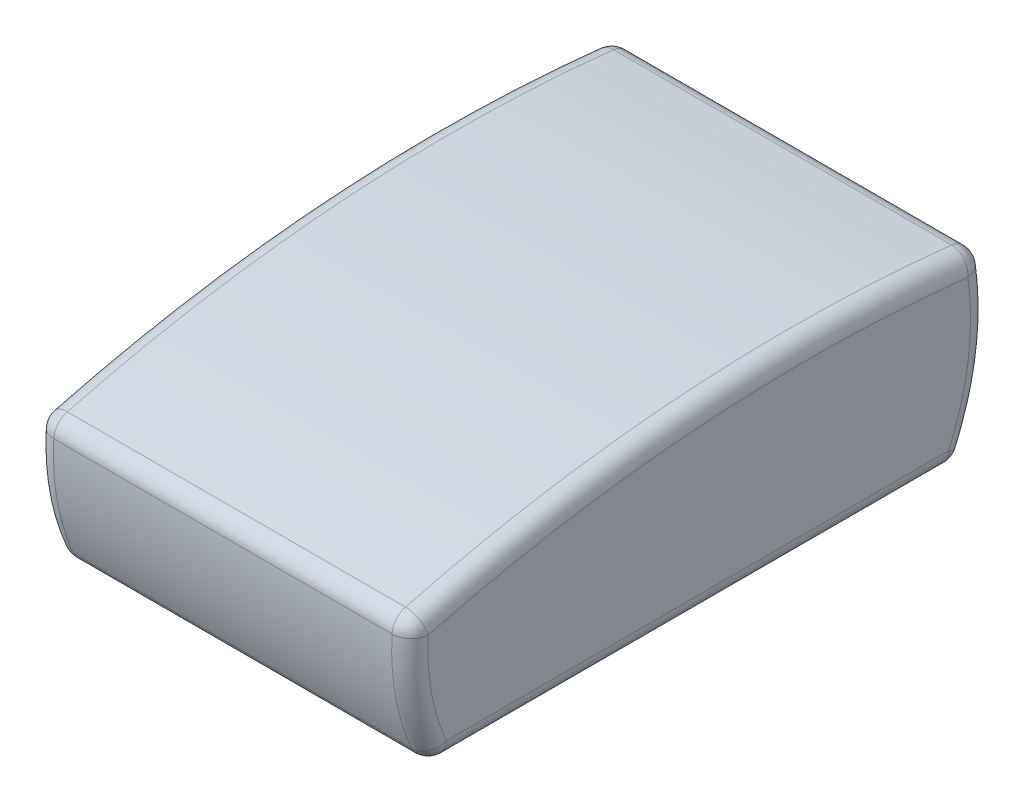
ISO-10303-21;
HEADER;
FILE_DESCRIPTION(('STEP AP214'),'2;1');
FILE_NAME('part.step','',(''),(''),'','','');
FILE_SCHEMA(('AUTOMOTIVE_DESIGN { 1 0 10303 214 1 1 1 1 }'));
ENDSEC;
DATA;
#1=APPLICATION_CONTEXT('core data for automotive mechanical design processes');
#2=APPLICATION_PROTOCOL_DEFINITION('international standard','automotive_design',2000,#1);
#3=PRODUCT_CONTEXT('',#1,'mechanical');
#4=PRODUCT('Part','Part','',(#3));
#5=PRODUCT_RELATED_PRODUCT_CATEGORY('part','',(#4));
#6=PRODUCT_DEFINITION_FORMATION('','',#4);
#7=PRODUCT_DEFINITION_CONTEXT('part definition',#1,'design');
#8=PRODUCT_DEFINITION('design','',#6,#7);
#9=PRODUCT_DEFINITION_SHAPE('','',#8);
#10=(LENGTH_UNIT() NAMED_UNIT(*) SI_UNIT(.MILLI.,.METRE.));
#11=(NAMED_UNIT(*) PLANE_ANGLE_UNIT() SI_UNIT($,.RADIAN.));
#12=(NAMED_UNIT(*) SI_UNIT($,.STERADIAN.) SOLID_ANGLE_UNIT());
#13=UNCERTAINTY_MEASURE_WITH_UNIT(LENGTH_MEASURE(1.E-05),#10,'distance_accuracy_value','');
#14=(GEOMETRIC_REPRESENTATION_CONTEXT(3) GLOBAL_UNCERTAINTY_ASSIGNED_CONTEXT((#13)) GLOBAL_UNIT_ASSIGNED_CONTEXT((#10,
#11,#12)) REPRESENTATION_CONTEXT('',''));
#15=CARTESIAN_POINT('',(0.,0.,0.));
#16=DIRECTION('',(0.,0.,1.));
#17=DIRECTION('',(1.,0.,0.));
#18=AXIS2_PLACEMENT_3D('',#15,#16,#17);
#19=CARTESIAN_POINT('',(62.,17.669622753354,7.61428652298865));
#20=DIRECTION('',(-1.,0.,0.));
#21=DIRECTION('',(0.,0.,1.));
#22=AXIS2_PLACEMENT_3D('',#19,#20,#21);
#23=CYLINDRICAL_SURFACE('',#22,40.);
#24=CARTESIAN_POINT('',(3.,17.669622753354,7.61428652298865));
#25=DIRECTION('',(-1.,0.,0.));
#26=DIRECTION('',(0.,0.,1.));
#27=AXIS2_PLACEMENT_3D('',#24,#25,#26);
#28=CIRCLE('',#27,40.);
#29=CARTESIAN_POINT('',(3.,19.8070187312472,47.5571399317486));
#30=VERTEX_POINT('',#29);
#31=CARTESIAN_POINT('',(3.,1.81057112810643,44.3360849749672));
#32=VERTEX_POINT('',#31);
#33=EDGE_CURVE('E269',#30,#32,#28,.F.);
#34=ORIENTED_EDGE('',*,*,#33,.T.);
#35=DIRECTION('',(-1.,0.,0.));
#36=VECTOR('',#35,1.);
#37=CARTESIAN_POINT('',(62.,1.81057112810643,44.3360849749672));
#38=LINE('',#37,#36);
#39=CARTESIAN_POINT('',(59.,1.81057112810643,44.3360849749672));
#40=VERTEX_POINT('',#39);
#41=EDGE_CURVE('E273',#32,#40,#38,.F.);
#42=ORIENTED_EDGE('',*,*,#41,.T.);
#43=CARTESIAN_POINT('',(59.,17.669622753354,7.61428652298865));
#44=DIRECTION('',(-1.,0.,0.));
#45=DIRECTION('',(0.,0.,1.));
#46=AXIS2_PLACEMENT_3D('',#43,#44,#45);
#47=CIRCLE('',#46,40.);
#48=CARTESIAN_POINT('',(59.,19.8070187312472,47.5571399317486));
#49=VERTEX_POINT('',#48);
#50=EDGE_CURVE('E271',#40,#49,#47,.T.);
#51=ORIENTED_EDGE('',*,*,#50,.T.);
#52=DIRECTION('',(-1.,0.,0.));
#53=VECTOR('',#52,1.);
#54=CARTESIAN_POINT('',(62.,19.8070187312472,47.5571399317486));
#55=LINE('',#54,#53);
#56=EDGE_CURVE('E267',#49,#30,#55,.T.);
#57=ORIENTED_EDGE('',*,*,#56,.T.);
#58=EDGE_LOOP('',(#34,#42,#51,#57));
#59=FACE_BOUND('',#58,.T.);
#60=ADVANCED_FACE('F33',(#59),#23,.T.);
#61=CARTESIAN_POINT('',(62.,0.,43.5));
#62=DIRECTION('',(0.,1.,0.));
#63=DIRECTION('',(0.,0.,1.));
#64=AXIS2_PLACEMENT_3D('',#61,#62,#63);
#65=PLANE('',#64);
#66=DIRECTION('',(0.,0.,-1.));
#67=VECTOR('',#66,1.);
#68=CARTESIAN_POINT('',(55.,0.,0.));
#69=LINE('',#68,#67);
#70=CARTESIAN_POINT('',(55.,0.,5.61428652298865));
#71=VERTEX_POINT('',#70);
#72=CARTESIAN_POINT('',(55.,0.,-2.44286006825142));
#73=VERTEX_POINT('',#72);
#74=EDGE_CURVE('E200',#71,#73,#69,.T.);
#75=ORIENTED_EDGE('',*,*,#74,.T.);
#76=CARTESIAN_POINT('',(51.,0.,-2.44286006825142));
#77=DIRECTION('',(0.,-1.,0.));
#78=DIRECTION('',(0.,0.,-1.));
#79=AXIS2_PLACEMENT_3D('',#76,#77,#78);
#80=CIRCLE('',#79,4.00000000000001);
#81=CARTESIAN_POINT('',(47.,0.,-2.44286006825142));
#82=VERTEX_POINT('',#81);
#83=EDGE_CURVE('E50',#82,#73,#80,.T.);
#84=ORIENTED_EDGE('',*,*,#83,.F.);
#85=DIRECTION('',(0.,0.,1.));
#86=VECTOR('',#85,1.);
#87=CARTESIAN_POINT('',(47.,0.,0.));
#88=LINE('',#87,#86);
#89=CARTESIAN_POINT('',(47.,0.,5.61428652298865));
#90=VERTEX_POINT('',#89);
#91=EDGE_CURVE('E191',#82,#90,#88,.T.);
#92=ORIENTED_EDGE('',*,*,#91,.T.);
#93=CARTESIAN_POINT('',(51.,0.,5.61428652298865));
#94=DIRECTION('',(0.,-1.,0.));
#95=DIRECTION('',(0.,0.,-1.));
#96=AXIS2_PLACEMENT_3D('',#93,#94,#95);
#97=CIRCLE('',#96,4.00000000000001);
#98=EDGE_CURVE('E194',#71,#90,#97,.T.);
#99=ORIENTED_EDGE('',*,*,#98,.F.);
#100=EDGE_LOOP('',(#75,#84,#92,#99));
#101=FACE_BOUND('',#100,.T.);
#102=CARTESIAN_POINT('',(11.,0.,5.61428652298865));
#103=DIRECTION('',(0.,-1.,0.));
#104=DIRECTION('',(0.,0.,-1.));
#105=AXIS2_PLACEMENT_3D('',#102,#103,#104);
#106=CIRCLE('',#105,4.);
#107=CARTESIAN_POINT('',(15.,0.,5.61428652298865));
#108=VERTEX_POINT('',#107);
#109=CARTESIAN_POINT('',(7.00000000000001,0.,5.61428652298865));
#110=VERTEX_POINT('',#109);
#111=EDGE_CURVE('E224',#108,#110,#106,.T.);
#112=ORIENTED_EDGE('',*,*,#111,.F.);
#113=DIRECTION('',(0.,0.,1.));
#114=VECTOR('',#113,1.);
#115=CARTESIAN_POINT('',(15.,0.,0.));
#116=LINE('',#115,#114);
#117=CARTESIAN_POINT('',(15.,0.,-2.44286006825142));
#118=VERTEX_POINT('',#117);
#119=EDGE_CURVE('E58',#118,#108,#116,.T.);
#120=ORIENTED_EDGE('',*,*,#119,.F.);
#121=CARTESIAN_POINT('',(11.,0.,-2.44286006825142));
#122=DIRECTION('',(0.,-1.,0.));
#123=DIRECTION('',(0.,0.,-1.));
#124=AXIS2_PLACEMENT_3D('',#121,#122,#123);
#125=CIRCLE('',#124,4.);
#126=CARTESIAN_POINT('',(7.00000000000001,0.,-2.44286006825142));
#127=VERTEX_POINT('',#126);
#128=EDGE_CURVE('E213',#127,#118,#125,.T.);
#129=ORIENTED_EDGE('',*,*,#128,.F.);
#130=DIRECTION('',(0.,0.,-1.));
#131=VECTOR('',#130,1.);
#132=CARTESIAN_POINT('',(7.00000000000001,0.,0.));
#133=LINE('',#132,#131);
#134=EDGE_CURVE('E227',#110,#127,#133,.T.);
#135=ORIENTED_EDGE('',*,*,#134,.F.);
#136=EDGE_LOOP('',(#112,#120,#129,#135));
#137=FACE_BOUND('',#136,.T.);
#138=DIRECTION('',(0.,0.,-1.));
#139=VECTOR('',#138,1.);
#140=CARTESIAN_POINT('',(3.,0.,-43.5));
#141=LINE('',#140,#139);
#142=CARTESIAN_POINT('',(3.,0.,41.5819500910688));
#143=VERTEX_POINT('',#142);
#144=CARTESIAN_POINT('',(3.,0.,-41.6007778792662));
#145=VERTEX_POINT('',#144);
#146=EDGE_CURVE('E253',#143,#145,#141,.T.);
#147=ORIENTED_EDGE('',*,*,#146,.T.);
#148=DIRECTION('',(-1.,0.,0.));
#149=VECTOR('',#148,1.);
#150=CARTESIAN_POINT('',(62.,0.,-41.6007778792662));
#151=LINE('',#150,#149);
#152=CARTESIAN_POINT('',(59.,0.,-41.6007778792662));
#153=VERTEX_POINT('',#152);
#154=EDGE_CURVE('E255',#145,#153,#151,.F.);
#155=ORIENTED_EDGE('',*,*,#154,.T.);
#156=DIRECTION('',(0.,0.,-1.));
#157=VECTOR('',#156,1.);
#158=CARTESIAN_POINT('',(59.,0.,43.5));
#159=LINE('',#158,#157);
#160=CARTESIAN_POINT('',(59.,0.,41.5819500910688));
#161=VERTEX_POINT('',#160);
#162=EDGE_CURVE('E249',#153,#161,#159,.F.);
#163=ORIENTED_EDGE('',*,*,#162,.T.);
#164=DIRECTION('',(-1.,0.,0.));
#165=VECTOR('',#164,1.);
#166=CARTESIAN_POINT('',(62.,0.,41.5819500910688));
#167=LINE('',#166,#165);
#168=EDGE_CURVE('E251',#161,#143,#167,.T.);
#169=ORIENTED_EDGE('',*,*,#168,.T.);
#170=EDGE_LOOP('',(#147,#155,#163,#169));
#171=FACE_BOUND('',#170,.T.);
#172=ADVANCED_FACE('F433',(#101,#137,#171),#65,.F.);
#173=CARTESIAN_POINT('',(62.,20.1185018573751,-3.2477220145891));
#174=DIRECTION('',(-1.,0.,0.));
#175=DIRECTION('',(0.,0.,1.));
#176=AXIS2_PLACEMENT_3D('',#173,#174,#175);
#177=CYLINDRICAL_SURFACE('',#176,45.);
#178=DIRECTION('',(-1.,0.,0.));
#179=VECTOR('',#178,1.);
#180=CARTESIAN_POINT('',(62.,1.77724986733036,-44.3402818696003));
#181=LINE('',#180,#179);
#182=CARTESIAN_POINT('',(59.,1.77724986733036,-44.3402818696003));
#183=VERTEX_POINT('',#182);
#184=CARTESIAN_POINT('',(3.,1.77724986733036,-44.3402818696003));
#185=VERTEX_POINT('',#184);
#186=EDGE_CURVE('E244',#183,#185,#181,.T.);
#187=ORIENTED_EDGE('',*,*,#186,.T.);
#188=CARTESIAN_POINT('',(3.,20.1185018573751,-3.2477220145891));
#189=DIRECTION('',(-1.,0.,0.));
#190=DIRECTION('',(0.,0.,1.));
#191=AXIS2_PLACEMENT_3D('',#188,#189,#190);
#192=CIRCLE('',#191,45.);
#193=CARTESIAN_POINT('',(3.,26.7115039153583,-47.7621278161207));
#194=VERTEX_POINT('',#193);
#195=EDGE_CURVE('E247',#185,#194,#192,.F.);
#196=ORIENTED_EDGE('',*,*,#195,.T.);
#197=DIRECTION('',(-1.,0.,0.));
#198=VECTOR('',#197,1.);
#199=CARTESIAN_POINT('',(62.,26.7115039153583,-47.7621278161207));
#200=LINE('',#199,#198);
#201=CARTESIAN_POINT('',(59.,26.7115039153583,-47.7621278161207));
#202=VERTEX_POINT('',#201);
#203=EDGE_CURVE('E242',#194,#202,#200,.F.);
#204=ORIENTED_EDGE('',*,*,#203,.T.);
#205=CARTESIAN_POINT('',(59.,20.1185018573751,-3.2477220145891));
#206=DIRECTION('',(-1.,0.,0.));
#207=DIRECTION('',(0.,0.,1.));
#208=AXIS2_PLACEMENT_3D('',#205,#206,#207);
#209=CIRCLE('',#208,45.);
#210=EDGE_CURVE('E240',#202,#183,#209,.T.);
#211=ORIENTED_EDGE('',*,*,#210,.T.);
#212=EDGE_LOOP('',(#187,#196,#204,#211));
#213=FACE_BOUND('',#212,.T.);
#214=ADVANCED_FACE('F439',(#213),#177,.T.);
#215=CARTESIAN_POINT('',(62.,-219.27880794698,-18.077179954302));
#216=DIRECTION('',(-1.,0.,0.));
#217=DIRECTION('',(0.,0.,1.));
#218=AXIS2_PLACEMENT_3D('',#215,#216,#217);
#219=CYLINDRICAL_SURFACE('',#218,250.);
#220=CARTESIAN_POINT('',(59.,-219.27880794698,-18.077179954302));
#221=DIRECTION('',(-1.,0.,0.));
#222=DIRECTION('',(0.,0.,1.));
#223=AXIS2_PLACEMENT_3D('',#220,#221,#222);
#224=CIRCLE('',#223,250.);
#225=CARTESIAN_POINT('',(59.,22.548643449665,45.322218710064));
#226=VERTEX_POINT('',#225);
#227=CARTESIAN_POINT('',(59.,29.2543685629452,-45.1190026348518));
#228=VERTEX_POINT('',#227);
#229=EDGE_CURVE('E287',#226,#228,#224,.T.);
#230=ORIENTED_EDGE('',*,*,#229,.T.);
#231=DIRECTION('',(-1.,0.,0.));
#232=VECTOR('',#231,1.);
#233=CARTESIAN_POINT('',(62.,29.2543685629452,-45.1190026348518));
#234=LINE('',#233,#232);
#235=CARTESIAN_POINT('',(3.,29.2543685629452,-45.1190026348518));
#236=VERTEX_POINT('',#235);
#237=EDGE_CURVE('E11',#228,#236,#234,.T.);
#238=ORIENTED_EDGE('',*,*,#237,.T.);
#239=CARTESIAN_POINT('',(3.,-219.27880794698,-18.077179954302));
#240=DIRECTION('',(-1.,0.,0.));
#241=DIRECTION('',(0.,0.,1.));
#242=AXIS2_PLACEMENT_3D('',#239,#240,#241);
#243=CIRCLE('',#242,250.);
#244=CARTESIAN_POINT('',(3.,22.548643449665,45.322218710064));
#245=VERTEX_POINT('',#244);
#246=EDGE_CURVE('E42',#236,#245,#243,.F.);
#247=ORIENTED_EDGE('',*,*,#246,.T.);
#248=DIRECTION('',(-1.,0.,0.));
#249=VECTOR('',#248,1.);
#250=CARTESIAN_POINT('',(62.,22.548643449665,45.322218710064));
#251=LINE('',#250,#249);
#252=EDGE_CURVE('E285',#245,#226,#251,.F.);
#253=ORIENTED_EDGE('',*,*,#252,.T.);
#254=EDGE_LOOP('',(#230,#238,#247,#253));
#255=FACE_BOUND('',#254,.T.);
#256=ADVANCED_FACE('F380',(#255),#219,.T.);
#257=CARTESIAN_POINT('',(62.,17.669622753354,7.61428652298865));
#258=DIRECTION('',(-1.,0.,0.));
#259=DIRECTION('',(0.,0.,1.));
#260=AXIS2_PLACEMENT_3D('',#257,#258,#259);
#261=PLANE('',#260);
#262=CARTESIAN_POINT('',(62.,17.669622753354,7.61428652298865));
#263=DIRECTION('',(-1.,0.,0.));
#264=DIRECTION('',(0.,0.,1.));
#265=AXIS2_PLACEMENT_3D('',#262,#263,#264);
#266=CIRCLE('',#265,37.);
#267=CARTESIAN_POINT('',(62.,19.6467140329052,44.5614259260916));
#268=VERTEX_POINT('',#267);
#269=CARTESIAN_POINT('',(62.,3.,41.5819500910688));
#270=VERTEX_POINT('',#269);
#271=EDGE_CURVE('E278',#268,#270,#266,.F.);
#272=ORIENTED_EDGE('',*,*,#271,.T.);
#273=DIRECTION('',(0.,0.,-1.));
#274=VECTOR('',#273,1.);
#275=CARTESIAN_POINT('',(62.,3.00000000000001,7.61428652298865));
#276=LINE('',#275,#274);
#277=CARTESIAN_POINT('',(62.,3.00000000000003,-41.6007778792662));
#278=VERTEX_POINT('',#277);
#279=EDGE_CURVE('E282',#270,#278,#276,.T.);
#280=ORIENTED_EDGE('',*,*,#279,.T.);
#281=CARTESIAN_POINT('',(62.,20.1185018573751,-3.2477220145891));
#282=DIRECTION('',(-1.,0.,0.));
#283=DIRECTION('',(0.,0.,1.));
#284=AXIS2_PLACEMENT_3D('',#281,#282,#283);
#285=CIRCLE('',#284,42.);
#286=CARTESIAN_POINT('',(62.,26.271970444826,-44.7945007626852));
#287=VERTEX_POINT('',#286);
#288=EDGE_CURVE('E280',#278,#287,#285,.F.);
#289=ORIENTED_EDGE('',*,*,#288,.T.);
#290=CARTESIAN_POINT('',(62.,-219.27880794698,-18.077179954302));
#291=DIRECTION('',(-1.,0.,0.));
#292=DIRECTION('',(0.,0.,1.));
#293=AXIS2_PLACEMENT_3D('',#290,#291,#292);
#294=CIRCLE('',#293,247.);
#295=EDGE_CURVE('E276',#287,#268,#294,.F.);
#296=ORIENTED_EDGE('',*,*,#295,.T.);
#297=EDGE_LOOP('',(#272,#280,#289,#296));
#298=FACE_BOUND('',#297,.T.);
#299=ADVANCED_FACE('F371',(#298),#261,.F.);
#300=CARTESIAN_POINT('',(0.,17.669622753354,7.61428652298865));
#301=DIRECTION('',(-1.,0.,0.));
#302=DIRECTION('',(0.,0.,1.));
#303=AXIS2_PLACEMENT_3D('',#300,#301,#302);
#304=PLANE('',#303);
#305=CARTESIAN_POINT('',(0.,20.1185018573751,-3.2477220145891));
#306=DIRECTION('',(-1.,0.,0.));
#307=DIRECTION('',(0.,0.,1.));
#308=AXIS2_PLACEMENT_3D('',#305,#306,#307);
#309=CIRCLE('',#308,42.);
#310=CARTESIAN_POINT('',(0.,26.271970444826,-44.7945007626852));
#311=VERTEX_POINT('',#310);
#312=CARTESIAN_POINT('',(0.,3.00000000000003,-41.6007778792662));
#313=VERTEX_POINT('',#312);
#314=EDGE_CURVE('E262',#311,#313,#309,.T.);
#315=ORIENTED_EDGE('',*,*,#314,.T.);
#316=DIRECTION('',(0.,0.,-1.));
#317=VECTOR('',#316,1.);
#318=CARTESIAN_POINT('',(0.,3.,43.5));
#319=LINE('',#318,#317);
#320=CARTESIAN_POINT('',(0.,3.,41.5819500910688));
#321=VERTEX_POINT('',#320);
#322=EDGE_CURVE('E264',#313,#321,#319,.F.);
#323=ORIENTED_EDGE('',*,*,#322,.T.);
#324=CARTESIAN_POINT('',(0.,17.669622753354,7.61428652298865));
#325=DIRECTION('',(-1.,0.,0.));
#326=DIRECTION('',(0.,0.,1.));
#327=AXIS2_PLACEMENT_3D('',#324,#325,#326);
#328=CIRCLE('',#327,37.);
#329=CARTESIAN_POINT('',(0.,19.6467140329052,44.5614259260916));
#330=VERTEX_POINT('',#329);
#331=EDGE_CURVE('E260',#321,#330,#328,.T.);
#332=ORIENTED_EDGE('',*,*,#331,.T.);
#333=CARTESIAN_POINT('',(0.,-219.27880794698,-18.077179954302));
#334=DIRECTION('',(-1.,0.,0.));
#335=DIRECTION('',(0.,0.,1.));
#336=AXIS2_PLACEMENT_3D('',#333,#334,#335);
#337=CIRCLE('',#336,247.);
#338=EDGE_CURVE('E258',#330,#311,#337,.T.);
#339=ORIENTED_EDGE('',*,*,#338,.T.);
#340=EDGE_LOOP('',(#315,#323,#332,#339));
#341=FACE_BOUND('',#340,.T.);
#342=ADVANCED_FACE('F489',(#341),#304,.T.);
#343=CARTESIAN_POINT('',(62.,19.6467140329052,44.5614259260916));
#344=DIRECTION('',(-1.,0.,0.));
#345=DIRECTION('',(0.,0.,1.));
#346=AXIS2_PLACEMENT_3D('',#343,#344,#345);
#347=CYLINDRICAL_SURFACE('',#346,3.);
#348=CARTESIAN_POINT('',(59.,19.6467140329053,44.5614259260916));
#349=DIRECTION('',(1.,0.,0.));
#350=DIRECTION('',(0.,0.,-1.));
#351=AXIS2_PLACEMENT_3D('',#348,#349,#350);
#352=CIRCLE('',#351,3.);
#353=EDGE_CURVE('E37',#226,#49,#352,.T.);
#354=ORIENTED_EDGE('',*,*,#353,.F.);
#355=ORIENTED_EDGE('',*,*,#252,.F.);
#356=CARTESIAN_POINT('',(3.,19.6467140329052,44.5614259260916));
#357=DIRECTION('',(-1.,0.,0.));
#358=DIRECTION('',(0.,0.,1.));
#359=AXIS2_PLACEMENT_3D('',#356,#357,#358);
#360=CIRCLE('',#359,3.);
#361=EDGE_CURVE('E348',#30,#245,#360,.T.);
#362=ORIENTED_EDGE('',*,*,#361,.F.);
#363=ORIENTED_EDGE('',*,*,#56,.F.);
#364=EDGE_LOOP('',(#354,#355,#362,#363));
#365=FACE_BOUND('',#364,.T.);
#366=ADVANCED_FACE('F35',(#365),#347,.T.);
#367=CARTESIAN_POINT('',(59.,19.6467140329052,44.5614259260916));
#368=DIRECTION('',(0.,0.,1.));
#369=DIRECTION('',(1.,0.,0.));
#370=AXIS2_PLACEMENT_3D('',#367,#368,#369);
#371=SPHERICAL_SURFACE('',#370,3.);
#372=CARTESIAN_POINT('',(59.,19.6467140329052,44.5614259260916));
#373=DIRECTION('',(0.,-0.253597594657465,0.96730980558658));
#374=DIRECTION('',(0.,-0.967309805586581,-0.253597594657465));
#375=AXIS2_PLACEMENT_3D('',#372,#373,#374);
#376=CIRCLE('',#375,3.);
#377=EDGE_CURVE('E343',#226,#268,#376,.F.);
#378=ORIENTED_EDGE('',*,*,#377,.F.);
#379=ORIENTED_EDGE('',*,*,#353,.T.);
#380=CARTESIAN_POINT('',(59.,19.6467140329052,44.5614259260916));
#381=DIRECTION('',(0.,0.998571335218999,-0.0534348994473306));
#382=DIRECTION('',(0.,0.0534348994473306,0.998571335218999));
#383=AXIS2_PLACEMENT_3D('',#380,#381,#382);
#384=CIRCLE('',#383,3.);
#385=EDGE_CURVE('E346',#268,#49,#384,.F.);
#386=ORIENTED_EDGE('',*,*,#385,.F.);
#387=EDGE_LOOP('',(#378,#379,#386));
#388=FACE_BOUND('',#387,.T.);
#389=ADVANCED_FACE('F359',(#388),#371,.T.);
#390=CARTESIAN_POINT('',(3.,19.6467140329052,44.5614259260916));
#391=DIRECTION('',(0.,0.,1.));
#392=DIRECTION('',(1.,0.,0.));
#393=AXIS2_PLACEMENT_3D('',#390,#391,#392);
#394=SPHERICAL_SURFACE('',#393,3.);
#395=CARTESIAN_POINT('',(3.,19.6467140329052,44.5614259260916));
#396=DIRECTION('',(0.,0.998571335218999,-0.0534348994473329));
#397=DIRECTION('',(0.,0.0534348994473329,0.998571335218999));
#398=AXIS2_PLACEMENT_3D('',#395,#396,#397);
#399=CIRCLE('',#398,3.);
#400=EDGE_CURVE('E337',#30,#330,#399,.F.);
#401=ORIENTED_EDGE('',*,*,#400,.F.);
#402=ORIENTED_EDGE('',*,*,#361,.T.);
#403=CARTESIAN_POINT('',(3.,19.6467140329053,44.5614259260916));
#404=DIRECTION('',(0.,-0.253597594657463,0.967309805586581));
#405=DIRECTION('',(0.,-0.967309805586581,-0.253597594657463));
#406=AXIS2_PLACEMENT_3D('',#403,#404,#405);
#407=CIRCLE('',#406,3.);
#408=EDGE_CURVE('E340',#330,#245,#407,.F.);
#409=ORIENTED_EDGE('',*,*,#408,.F.);
#410=EDGE_LOOP('',(#401,#402,#409));
#411=FACE_BOUND('',#410,.T.);
#412=ADVANCED_FACE('F395',(#411),#394,.T.);
#413=CARTESIAN_POINT('',(59.,17.669622753354,7.61428652298865));
#414=DIRECTION('',(-1.,0.,0.));
#415=DIRECTION('',(0.,0.,1.));
#416=AXIS2_PLACEMENT_3D('',#413,#414,#415);
#417=TOROIDAL_SURFACE('',#416,37.,3.);
#418=ORIENTED_EDGE('',*,*,#385,.T.);
#419=ORIENTED_EDGE('',*,*,#50,.F.);
#420=CARTESIAN_POINT('',(59.,3.,41.5819500910688));
#421=DIRECTION('',(0.,-0.918044961299463,-0.39647629063119));
#422=DIRECTION('',(0.,0.39647629063119,-0.918044961299463));
#423=AXIS2_PLACEMENT_3D('',#420,#421,#422);
#424=CIRCLE('',#423,3.);
#425=EDGE_CURVE('E332',#270,#40,#424,.T.);
#426=ORIENTED_EDGE('',*,*,#425,.F.);
#427=ORIENTED_EDGE('',*,*,#271,.F.);
#428=EDGE_LOOP('',(#418,#419,#426,#427));
#429=FACE_BOUND('',#428,.T.);
#430=ADVANCED_FACE('F367',(#429),#417,.T.);
#431=CARTESIAN_POINT('',(59.,-219.27880794698,-18.077179954302));
#432=DIRECTION('',(-1.,0.,0.));
#433=DIRECTION('',(0.,0.,1.));
#434=AXIS2_PLACEMENT_3D('',#431,#432,#433);
#435=TOROIDAL_SURFACE('',#434,247.,3.);
#436=ORIENTED_EDGE('',*,*,#377,.T.);
#437=ORIENTED_EDGE('',*,*,#295,.F.);
#438=CARTESIAN_POINT('',(59.,26.2719704448261,-44.7945007626852));
#439=DIRECTION('',(0.,-0.108167290722198,-0.994132706039701));
#440=DIRECTION('',(0.,0.994132706039701,-0.108167290722198));
#441=AXIS2_PLACEMENT_3D('',#438,#439,#440);
#442=CIRCLE('',#441,3.);
#443=EDGE_CURVE('E329',#228,#287,#442,.T.);
#444=ORIENTED_EDGE('',*,*,#443,.F.);
#445=ORIENTED_EDGE('',*,*,#229,.F.);
#446=EDGE_LOOP('',(#436,#437,#444,#445));
#447=FACE_BOUND('',#446,.T.);
#448=ADVANCED_FACE('F377',(#447),#435,.T.);
#449=CARTESIAN_POINT('',(62.,26.271970444826,-44.7945007626851));
#450=DIRECTION('',(-1.,0.,0.));
#451=DIRECTION('',(0.,0.,1.));
#452=AXIS2_PLACEMENT_3D('',#449,#450,#451);
#453=CYLINDRICAL_SURFACE('',#452,3.);
#454=CARTESIAN_POINT('',(3.,26.2719704448261,-44.7945007626852));
#455=DIRECTION('',(-1.,0.,0.));
#456=DIRECTION('',(0.,0.,1.));
#457=AXIS2_PLACEMENT_3D('',#454,#455,#456);
#458=CIRCLE('',#457,3.);
#459=EDGE_CURVE('E323',#236,#194,#458,.T.);
#460=ORIENTED_EDGE('',*,*,#459,.F.);
#461=ORIENTED_EDGE('',*,*,#237,.F.);
#462=CARTESIAN_POINT('',(59.,26.2719704448261,-44.7945007626852));
#463=DIRECTION('',(1.,0.,0.));
#464=DIRECTION('',(0.,0.,-1.));
#465=AXIS2_PLACEMENT_3D('',#462,#463,#464);
#466=CIRCLE('',#465,3.);
#467=EDGE_CURVE('E326',#202,#228,#466,.T.);
#468=ORIENTED_EDGE('',*,*,#467,.F.);
#469=ORIENTED_EDGE('',*,*,#203,.F.);
#470=EDGE_LOOP('',(#460,#461,#468,#469));
#471=FACE_BOUND('',#470,.T.);
#472=ADVANCED_FACE('F384',(#471),#453,.T.);
#473=CARTESIAN_POINT('',(3.,-219.27880794698,-18.077179954302));
#474=DIRECTION('',(-1.,0.,0.));
#475=DIRECTION('',(0.,0.,1.));
#476=AXIS2_PLACEMENT_3D('',#473,#474,#475);
#477=TOROIDAL_SURFACE('',#476,247.,3.);
#478=ORIENTED_EDGE('',*,*,#408,.T.);
#479=ORIENTED_EDGE('',*,*,#246,.F.);
#480=CARTESIAN_POINT('',(3.,26.271970444826,-44.7945007626852));
#481=DIRECTION('',(0.,-0.10816729072217,-0.994132706039705));
#482=DIRECTION('',(0.,0.994132706039705,-0.10816729072217));
#483=AXIS2_PLACEMENT_3D('',#480,#481,#482);
#484=CIRCLE('',#483,3.);
#485=EDGE_CURVE('E321',#311,#236,#484,.T.);
#486=ORIENTED_EDGE('',*,*,#485,.F.);
#487=ORIENTED_EDGE('',*,*,#338,.F.);
#488=EDGE_LOOP('',(#478,#479,#486,#487));
#489=FACE_BOUND('',#488,.T.);
#490=ADVANCED_FACE('F392',(#489),#477,.T.);
#491=CARTESIAN_POINT('',(3.,17.669622753354,7.61428652298865));
#492=DIRECTION('',(-1.,0.,0.));
#493=DIRECTION('',(0.,0.,1.));
#494=AXIS2_PLACEMENT_3D('',#491,#492,#493);
#495=TOROIDAL_SURFACE('',#494,37.,3.);
#496=ORIENTED_EDGE('',*,*,#400,.T.);
#497=ORIENTED_EDGE('',*,*,#331,.F.);
#498=CARTESIAN_POINT('',(3.,3.,41.5819500910688));
#499=DIRECTION('',(0.,-0.918044961299463,-0.39647629063119));
#500=DIRECTION('',(0.,0.39647629063119,-0.918044961299463));
#501=AXIS2_PLACEMENT_3D('',#498,#499,#500);
#502=CIRCLE('',#501,3.);
#503=EDGE_CURVE('E318',#32,#321,#502,.T.);
#504=ORIENTED_EDGE('',*,*,#503,.F.);
#505=ORIENTED_EDGE('',*,*,#33,.F.);
#506=EDGE_LOOP('',(#496,#497,#504,#505));
#507=FACE_BOUND('',#506,.T.);
#508=ADVANCED_FACE('F399',(#507),#495,.T.);
#509=CARTESIAN_POINT('',(62.,3.,41.5819500910688));
#510=DIRECTION('',(-1.,0.,0.));
#511=DIRECTION('',(0.,0.,1.));
#512=AXIS2_PLACEMENT_3D('',#509,#510,#511);
#513=CYLINDRICAL_SURFACE('',#512,3.);
#514=CARTESIAN_POINT('',(59.,3.,41.5819500910688));
#515=DIRECTION('',(1.,0.,0.));
#516=DIRECTION('',(0.,0.,-1.));
#517=AXIS2_PLACEMENT_3D('',#514,#515,#516);
#518=CIRCLE('',#517,3.);
#519=EDGE_CURVE('E334',#40,#161,#518,.T.);
#520=ORIENTED_EDGE('',*,*,#519,.F.);
#521=ORIENTED_EDGE('',*,*,#41,.F.);
#522=CARTESIAN_POINT('',(3.,3.,41.5819500910688));
#523=DIRECTION('',(-1.,0.,0.));
#524=DIRECTION('',(0.,0.,1.));
#525=AXIS2_PLACEMENT_3D('',#522,#523,#524);
#526=CIRCLE('',#525,3.);
#527=EDGE_CURVE('E315',#143,#32,#526,.T.);
#528=ORIENTED_EDGE('',*,*,#527,.F.);
#529=ORIENTED_EDGE('',*,*,#168,.F.);
#530=EDGE_LOOP('',(#520,#521,#528,#529));
#531=FACE_BOUND('',#530,.T.);
#532=ADVANCED_FACE('F405',(#531),#513,.T.);
#533=CARTESIAN_POINT('',(59.,3.,41.5819500910688));
#534=DIRECTION('',(0.,0.,1.));
#535=DIRECTION('',(1.,0.,0.));
#536=AXIS2_PLACEMENT_3D('',#533,#534,#535);
#537=SPHERICAL_SURFACE('',#536,3.);
#538=ORIENTED_EDGE('',*,*,#425,.T.);
#539=ORIENTED_EDGE('',*,*,#519,.T.);
#540=CARTESIAN_POINT('',(59.,3.,41.5819500910688));
#541=DIRECTION('',(0.,0.,1.));
#542=DIRECTION('',(1.,0.,0.));
#543=AXIS2_PLACEMENT_3D('',#540,#541,#542);
#544=CIRCLE('',#543,3.);
#545=EDGE_CURVE('E312',#270,#161,#544,.F.);
#546=ORIENTED_EDGE('',*,*,#545,.F.);
#547=EDGE_LOOP('',(#538,#539,#546));
#548=FACE_BOUND('',#547,.T.);
#549=ADVANCED_FACE('F409',(#548),#537,.T.);
#550=CARTESIAN_POINT('',(59.,26.2719704448261,-44.7945007626852));
#551=DIRECTION('',(0.,0.,1.));
#552=DIRECTION('',(1.,0.,0.));
#553=AXIS2_PLACEMENT_3D('',#550,#551,#552);
#554=SPHERICAL_SURFACE('',#553,3.);
#555=ORIENTED_EDGE('',*,*,#467,.T.);
#556=ORIENTED_EDGE('',*,*,#443,.T.);
#557=CARTESIAN_POINT('',(59.,26.271970444826,-44.7945007626852));
#558=DIRECTION('',(0.,0.989209017811812,0.146511156844077));
#559=DIRECTION('',(0.,-0.146511156844077,0.989209017811812));
#560=AXIS2_PLACEMENT_3D('',#557,#558,#559);
#561=CIRCLE('',#560,3.);
#562=EDGE_CURVE('E309',#202,#287,#561,.F.);
#563=ORIENTED_EDGE('',*,*,#562,.F.);
#564=EDGE_LOOP('',(#555,#556,#563));
#565=FACE_BOUND('',#564,.T.);
#566=ADVANCED_FACE('F421',(#565),#554,.T.);
#567=CARTESIAN_POINT('',(3.,26.2719704448261,-44.7945007626852));
#568=DIRECTION('',(0.,0.,1.));
#569=DIRECTION('',(1.,0.,0.));
#570=AXIS2_PLACEMENT_3D('',#567,#568,#569);
#571=SPHERICAL_SURFACE('',#570,3.);
#572=ORIENTED_EDGE('',*,*,#485,.T.);
#573=ORIENTED_EDGE('',*,*,#459,.T.);
#574=CARTESIAN_POINT('',(3.,26.2719704448261,-44.7945007626852));
#575=DIRECTION('',(0.,0.989209017811813,0.146511156844071));
#576=DIRECTION('',(0.,-0.146511156844071,0.989209017811813));
#577=AXIS2_PLACEMENT_3D('',#574,#575,#576);
#578=CIRCLE('',#577,3.);
#579=EDGE_CURVE('E306',#311,#194,#578,.F.);
#580=ORIENTED_EDGE('',*,*,#579,.F.);
#581=EDGE_LOOP('',(#572,#573,#580));
#582=FACE_BOUND('',#581,.T.);
#583=ADVANCED_FACE('F423',(#582),#571,.T.);
#584=CARTESIAN_POINT('',(3.,3.,41.5819500910688));
#585=DIRECTION('',(0.,0.,1.));
#586=DIRECTION('',(1.,0.,0.));
#587=AXIS2_PLACEMENT_3D('',#584,#585,#586);
#588=SPHERICAL_SURFACE('',#587,3.);
#589=ORIENTED_EDGE('',*,*,#527,.T.);
#590=ORIENTED_EDGE('',*,*,#503,.T.);
#591=CARTESIAN_POINT('',(3.,3.,41.5819500910688));
#592=DIRECTION('',(0.,0.,1.));
#593=DIRECTION('',(1.,0.,0.));
#594=AXIS2_PLACEMENT_3D('',#591,#592,#593);
#595=CIRCLE('',#594,3.);
#596=EDGE_CURVE('E304',#143,#321,#595,.F.);
#597=ORIENTED_EDGE('',*,*,#596,.F.);
#598=EDGE_LOOP('',(#589,#590,#597));
#599=FACE_BOUND('',#598,.T.);
#600=ADVANCED_FACE('F429',(#599),#588,.T.);
#601=CARTESIAN_POINT('',(59.,3.00000000000001,7.61428652298865));
#602=DIRECTION('',(0.,0.,-1.));
#603=DIRECTION('',(0.,1.,0.));
#604=AXIS2_PLACEMENT_3D('',#601,#602,#603);
#605=CYLINDRICAL_SURFACE('',#604,3.);
#606=ORIENTED_EDGE('',*,*,#545,.T.);
#607=ORIENTED_EDGE('',*,*,#162,.F.);
#608=CARTESIAN_POINT('',(59.,3.00000000000002,-41.6007778792663));
#609=DIRECTION('',(0.,0.,-1.));
#610=DIRECTION('',(0.,1.,0.));
#611=AXIS2_PLACEMENT_3D('',#608,#609,#610);
#612=CIRCLE('',#611,3.);
#613=EDGE_CURVE('E301',#278,#153,#612,.T.);
#614=ORIENTED_EDGE('',*,*,#613,.F.);
#615=ORIENTED_EDGE('',*,*,#279,.F.);
#616=EDGE_LOOP('',(#606,#607,#614,#615));
#617=FACE_BOUND('',#616,.T.);
#618=ADVANCED_FACE('F412',(#617),#605,.T.);
#619=CARTESIAN_POINT('',(59.,20.1185018573751,-3.2477220145891));
#620=DIRECTION('',(-1.,0.,0.));
#621=DIRECTION('',(0.,0.,1.));
#622=AXIS2_PLACEMENT_3D('',#619,#620,#621);
#623=TOROIDAL_SURFACE('',#622,42.,3.);
#624=ORIENTED_EDGE('',*,*,#562,.T.);
#625=ORIENTED_EDGE('',*,*,#288,.F.);
#626=CARTESIAN_POINT('',(59.,3.00000000000001,-41.6007778792662));
#627=DIRECTION('',(0.,-0.913167996778027,0.407583377556549));
#628=DIRECTION('',(0.,-0.407583377556549,-0.913167996778028));
#629=AXIS2_PLACEMENT_3D('',#626,#627,#628);
#630=CIRCLE('',#629,3.);
#631=EDGE_CURVE('E299',#183,#278,#630,.T.);
#632=ORIENTED_EDGE('',*,*,#631,.F.);
#633=ORIENTED_EDGE('',*,*,#210,.F.);
#634=EDGE_LOOP('',(#624,#625,#632,#633));
#635=FACE_BOUND('',#634,.T.);
#636=ADVANCED_FACE('F418',(#635),#623,.T.);
#637=CARTESIAN_POINT('',(3.,20.1185018573751,-3.2477220145891));
#638=DIRECTION('',(-1.,0.,0.));
#639=DIRECTION('',(0.,0.,1.));
#640=AXIS2_PLACEMENT_3D('',#637,#638,#639);
#641=TOROIDAL_SURFACE('',#640,42.,3.);
#642=ORIENTED_EDGE('',*,*,#579,.T.);
#643=ORIENTED_EDGE('',*,*,#195,.F.);
#644=CARTESIAN_POINT('',(3.,3.00000000000003,-41.6007778792662));
#645=DIRECTION('',(0.,-0.913167996778024,0.407583377556556));
#646=DIRECTION('',(0.,-0.407583377556556,-0.913167996778024));
#647=AXIS2_PLACEMENT_3D('',#644,#645,#646);
#648=CIRCLE('',#647,3.);
#649=EDGE_CURVE('E296',#313,#185,#648,.T.);
#650=ORIENTED_EDGE('',*,*,#649,.F.);
#651=ORIENTED_EDGE('',*,*,#314,.F.);
#652=EDGE_LOOP('',(#642,#643,#650,#651));
#653=FACE_BOUND('',#652,.T.);
#654=ADVANCED_FACE('F459',(#653),#641,.T.);
#655=CARTESIAN_POINT('',(3.,3.,43.5));
#656=DIRECTION('',(0.,0.,1.));
#657=DIRECTION('',(0.,-1.,0.));
#658=AXIS2_PLACEMENT_3D('',#655,#656,#657);
#659=CYLINDRICAL_SURFACE('',#658,3.);
#660=ORIENTED_EDGE('',*,*,#596,.T.);
#661=ORIENTED_EDGE('',*,*,#322,.F.);
#662=CARTESIAN_POINT('',(3.,3.00000000000002,-41.6007778792662));
#663=DIRECTION('',(0.,0.,-1.));
#664=DIRECTION('',(-1.,0.,0.));
#665=AXIS2_PLACEMENT_3D('',#662,#663,#664);
#666=CIRCLE('',#665,3.);
#667=EDGE_CURVE('E293',#145,#313,#666,.T.);
#668=ORIENTED_EDGE('',*,*,#667,.F.);
#669=ORIENTED_EDGE('',*,*,#146,.F.);
#670=EDGE_LOOP('',(#660,#661,#668,#669));
#671=FACE_BOUND('',#670,.T.);
#672=ADVANCED_FACE('F456',(#671),#659,.T.);
#673=CARTESIAN_POINT('',(59.,3.00000000000002,-41.6007778792662));
#674=DIRECTION('',(0.,0.,1.));
#675=DIRECTION('',(1.,0.,0.));
#676=AXIS2_PLACEMENT_3D('',#673,#674,#675);
#677=SPHERICAL_SURFACE('',#676,3.);
#678=ORIENTED_EDGE('',*,*,#631,.T.);
#679=ORIENTED_EDGE('',*,*,#613,.T.);
#680=CARTESIAN_POINT('',(59.,3.00000000000002,-41.6007778792662));
#681=DIRECTION('',(1.,0.,0.));
#682=DIRECTION('',(0.,0.,-1.));
#683=AXIS2_PLACEMENT_3D('',#680,#681,#682);
#684=CIRCLE('',#683,3.);
#685=EDGE_CURVE('E291',#183,#153,#684,.F.);
#686=ORIENTED_EDGE('',*,*,#685,.F.);
#687=EDGE_LOOP('',(#678,#679,#686));
#688=FACE_BOUND('',#687,.T.);
#689=ADVANCED_FACE('F452',(#688),#677,.T.);
#690=CARTESIAN_POINT('',(3.,3.00000000000002,-41.6007778792662));
#691=DIRECTION('',(0.,0.,1.));
#692=DIRECTION('',(1.,0.,0.));
#693=AXIS2_PLACEMENT_3D('',#690,#691,#692);
#694=SPHERICAL_SURFACE('',#693,3.);
#695=ORIENTED_EDGE('',*,*,#667,.T.);
#696=ORIENTED_EDGE('',*,*,#649,.T.);
#697=CARTESIAN_POINT('',(3.,3.00000000000001,-41.6007778792662));
#698=DIRECTION('',(-1.,0.,0.));
#699=DIRECTION('',(0.,0.,1.));
#700=AXIS2_PLACEMENT_3D('',#697,#698,#699);
#701=CIRCLE('',#700,3.);
#702=EDGE_CURVE('E234',#145,#185,#701,.F.);
#703=ORIENTED_EDGE('',*,*,#702,.F.);
#704=EDGE_LOOP('',(#695,#696,#703));
#705=FACE_BOUND('',#704,.T.);
#706=ADVANCED_FACE('F448',(#705),#694,.T.);
#707=CARTESIAN_POINT('',(62.,3.00000000000001,-41.6007778792662));
#708=DIRECTION('',(-1.,0.,0.));
#709=DIRECTION('',(0.,0.,1.));
#710=AXIS2_PLACEMENT_3D('',#707,#708,#709);
#711=CYLINDRICAL_SURFACE('',#710,3.);
#712=ORIENTED_EDGE('',*,*,#685,.T.);
#713=ORIENTED_EDGE('',*,*,#154,.F.);
#714=ORIENTED_EDGE('',*,*,#702,.T.);
#715=ORIENTED_EDGE('',*,*,#186,.F.);
#716=EDGE_LOOP('',(#712,#713,#714,#715));
#717=FACE_BOUND('',#716,.T.);
#718=ADVANCED_FACE('F444',(#717),#711,.T.);
#719=CARTESIAN_POINT('',(15.,20.,0.));
#720=DIRECTION('',(1.,0.,0.));
#721=DIRECTION('',(0.,0.,-1.));
#722=AXIS2_PLACEMENT_3D('',#719,#720,#721);
#723=PLANE('',#722);
#724=ORIENTED_EDGE('',*,*,#119,.T.);
#725=DIRECTION('',(0.,-1.,0.));
#726=VECTOR('',#725,1.);
#727=CARTESIAN_POINT('',(15.,20.,5.61428652298865));
#728=LINE('',#727,#726);
#729=CARTESIAN_POINT('',(15.,20.,5.61428652298865));
#730=VERTEX_POINT('',#729);
#731=EDGE_CURVE('E222',#730,#108,#728,.T.);
#732=ORIENTED_EDGE('',*,*,#731,.F.);
#733=DIRECTION('',(0.,0.,1.));
#734=VECTOR('',#733,1.);
#735=CARTESIAN_POINT('',(15.,20.,0.));
#736=LINE('',#735,#734);
#737=CARTESIAN_POINT('',(15.,20.,-2.44286006825141));
#738=VERTEX_POINT('',#737);
#739=EDGE_CURVE('E209',#738,#730,#736,.T.);
#740=ORIENTED_EDGE('',*,*,#739,.F.);
#741=DIRECTION('',(0.,-1.,0.));
#742=VECTOR('',#741,1.);
#743=CARTESIAN_POINT('',(15.,20.,-2.44286006825141));
#744=LINE('',#743,#742);
#745=EDGE_CURVE('E232',#738,#118,#744,.T.);
#746=ORIENTED_EDGE('',*,*,#745,.T.);
#747=EDGE_LOOP('',(#724,#732,#740,#746));
#748=FACE_BOUND('',#747,.T.);
#749=ADVANCED_FACE('F447',(#748),#723,.F.);
#750=CARTESIAN_POINT('',(11.,20.,-2.44286006825141));
#751=DIRECTION('',(0.,-1.,0.));
#752=DIRECTION('',(0.,0.,-1.));
#753=AXIS2_PLACEMENT_3D('',#750,#751,#752);
#754=CYLINDRICAL_SURFACE('',#753,4.);
#755=ORIENTED_EDGE('',*,*,#128,.T.);
#756=ORIENTED_EDGE('',*,*,#745,.F.);
#757=CARTESIAN_POINT('',(11.,20.,-2.44286006825141));
#758=DIRECTION('',(0.,-1.,0.));
#759=DIRECTION('',(0.,0.,-1.));
#760=AXIS2_PLACEMENT_3D('',#757,#758,#759);
#761=CIRCLE('',#760,4.);
#762=CARTESIAN_POINT('',(7.00000000000001,20.,-2.44286006825141));
#763=VERTEX_POINT('',#762);
#764=EDGE_CURVE('E219',#763,#738,#761,.T.);
#765=ORIENTED_EDGE('',*,*,#764,.F.);
#766=DIRECTION('',(0.,-1.,0.));
#767=VECTOR('',#766,1.);
#768=CARTESIAN_POINT('',(7.00000000000001,20.,-2.44286006825141));
#769=LINE('',#768,#767);
#770=EDGE_CURVE('E235',#763,#127,#769,.T.);
#771=ORIENTED_EDGE('',*,*,#770,.T.);
#772=EDGE_LOOP('',(#755,#756,#765,#771));
#773=FACE_BOUND('',#772,.T.);
#774=ADVANCED_FACE('F497',(#773),#754,.F.);
#775=CARTESIAN_POINT('',(7.00000000000001,20.,0.));
#776=DIRECTION('',(-1.,0.,0.));
#777=DIRECTION('',(0.,0.,1.));
#778=AXIS2_PLACEMENT_3D('',#775,#776,#777);
#779=PLANE('',#778);
#780=ORIENTED_EDGE('',*,*,#134,.T.);
#781=ORIENTED_EDGE('',*,*,#770,.F.);
#782=DIRECTION('',(0.,0.,-1.));
#783=VECTOR('',#782,1.);
#784=CARTESIAN_POINT('',(7.00000000000001,20.,0.));
#785=LINE('',#784,#783);
#786=CARTESIAN_POINT('',(7.00000000000001,20.,5.61428652298865));
#787=VERTEX_POINT('',#786);
#788=EDGE_CURVE('E216',#787,#763,#785,.T.);
#789=ORIENTED_EDGE('',*,*,#788,.F.);
#790=DIRECTION('',(0.,-1.,0.));
#791=VECTOR('',#790,1.);
#792=CARTESIAN_POINT('',(7.00000000000001,20.,5.61428652298865));
#793=LINE('',#792,#791);
#794=EDGE_CURVE('E237',#787,#110,#793,.T.);
#795=ORIENTED_EDGE('',*,*,#794,.T.);
#796=EDGE_LOOP('',(#780,#781,#789,#795));
#797=FACE_BOUND('',#796,.T.);
#798=ADVANCED_FACE('F502',(#797),#779,.F.);
#799=CARTESIAN_POINT('',(11.,20.,5.61428652298865));
#800=DIRECTION('',(0.,-1.,0.));
#801=DIRECTION('',(0.,0.,-1.));
#802=AXIS2_PLACEMENT_3D('',#799,#800,#801);
#803=CYLINDRICAL_SURFACE('',#802,4.);
#804=ORIENTED_EDGE('',*,*,#111,.T.);
#805=ORIENTED_EDGE('',*,*,#794,.F.);
#806=CARTESIAN_POINT('',(11.,20.,5.61428652298865));
#807=DIRECTION('',(0.,-1.,0.));
#808=DIRECTION('',(0.,0.,-1.));
#809=AXIS2_PLACEMENT_3D('',#806,#807,#808);
#810=CIRCLE('',#809,4.);
#811=EDGE_CURVE('E212',#730,#787,#810,.T.);
#812=ORIENTED_EDGE('',*,*,#811,.F.);
#813=ORIENTED_EDGE('',*,*,#731,.T.);
#814=EDGE_LOOP('',(#804,#805,#812,#813));
#815=FACE_BOUND('',#814,.T.);
#816=ADVANCED_FACE('F498',(#815),#803,.F.);
#817=CARTESIAN_POINT('',(0.,20.,0.));
#818=DIRECTION('',(0.,-1.,0.));
#819=DIRECTION('',(0.,0.,-1.));
#820=AXIS2_PLACEMENT_3D('',#817,#818,#819);
#821=PLANE('',#820);
#822=ORIENTED_EDGE('',*,*,#739,.T.);
#823=ORIENTED_EDGE('',*,*,#811,.T.);
#824=ORIENTED_EDGE('',*,*,#788,.T.);
#825=ORIENTED_EDGE('',*,*,#764,.T.);
#826=EDGE_LOOP('',(#822,#823,#824,#825));
#827=FACE_BOUND('',#826,.T.);
#828=ADVANCED_FACE('F501',(#827),#821,.T.);
#829=CARTESIAN_POINT('',(51.,20.,-2.44286006825141));
#830=DIRECTION('',(0.,-1.,0.));
#831=DIRECTION('',(0.,0.,-1.));
#832=AXIS2_PLACEMENT_3D('',#829,#830,#831);
#833=CYLINDRICAL_SURFACE('',#832,4.00000000000001);
#834=ORIENTED_EDGE('',*,*,#83,.T.);
#835=DIRECTION('',(0.,-1.,0.));
#836=VECTOR('',#835,1.);
#837=CARTESIAN_POINT('',(55.,20.,-2.44286006825141));
#838=LINE('',#837,#836);
#839=CARTESIAN_POINT('',(55.,20.,-2.44286006825141));
#840=VERTEX_POINT('',#839);
#841=EDGE_CURVE('E175',#840,#73,#838,.T.);
#842=ORIENTED_EDGE('',*,*,#841,.F.);
#843=CARTESIAN_POINT('',(51.,20.,-2.44286006825141));
#844=DIRECTION('',(0.,-1.,0.));
#845=DIRECTION('',(0.,0.,-1.));
#846=AXIS2_PLACEMENT_3D('',#843,#844,#845);
#847=CIRCLE('',#846,4.00000000000001);
#848=CARTESIAN_POINT('',(47.,20.,-2.44286006825141));
#849=VERTEX_POINT('',#848);
#850=EDGE_CURVE('E183',#849,#840,#847,.T.);
#851=ORIENTED_EDGE('',*,*,#850,.F.);
#852=DIRECTION('',(0.,-1.,0.));
#853=VECTOR('',#852,1.);
#854=CARTESIAN_POINT('',(47.,20.,-2.44286006825141));
#855=LINE('',#854,#853);
#856=EDGE_CURVE('E204',#849,#82,#855,.T.);
#857=ORIENTED_EDGE('',*,*,#856,.T.);
#858=EDGE_LOOP('',(#834,#842,#851,#857));
#859=FACE_BOUND('',#858,.T.);
#860=ADVANCED_FACE('F186',(#859),#833,.F.);
#861=CARTESIAN_POINT('',(47.,20.,0.));
#862=DIRECTION('',(1.,0.,0.));
#863=DIRECTION('',(0.,0.,-1.));
#864=AXIS2_PLACEMENT_3D('',#861,#862,#863);
#865=PLANE('',#864);
#866=ORIENTED_EDGE('',*,*,#91,.F.);
#867=ORIENTED_EDGE('',*,*,#856,.F.);
#868=DIRECTION('',(0.,0.,1.));
#869=VECTOR('',#868,1.);
#870=CARTESIAN_POINT('',(47.,20.,0.));
#871=LINE('',#870,#869);
#872=CARTESIAN_POINT('',(47.,20.,5.61428652298865));
#873=VERTEX_POINT('',#872);
#874=EDGE_CURVE('E187',#849,#873,#871,.T.);
#875=ORIENTED_EDGE('',*,*,#874,.T.);
#876=DIRECTION('',(0.,-1.,0.));
#877=VECTOR('',#876,1.);
#878=CARTESIAN_POINT('',(47.,20.,5.61428652298865));
#879=LINE('',#878,#877);
#880=EDGE_CURVE('E206',#873,#90,#879,.T.);
#881=ORIENTED_EDGE('',*,*,#880,.T.);
#882=EDGE_LOOP('',(#866,#867,#875,#881));
#883=FACE_BOUND('',#882,.T.);
#884=ADVANCED_FACE('F515',(#883),#865,.T.);
#885=CARTESIAN_POINT('',(51.,20.,5.61428652298865));
#886=DIRECTION('',(0.,-1.,0.));
#887=DIRECTION('',(0.,0.,-1.));
#888=AXIS2_PLACEMENT_3D('',#885,#886,#887);
#889=CYLINDRICAL_SURFACE('',#888,4.00000000000001);
#890=ORIENTED_EDGE('',*,*,#98,.T.);
#891=ORIENTED_EDGE('',*,*,#880,.F.);
#892=CARTESIAN_POINT('',(51.,20.,5.61428652298865));
#893=DIRECTION('',(0.,-1.,0.));
#894=DIRECTION('',(0.,0.,-1.));
#895=AXIS2_PLACEMENT_3D('',#892,#893,#894);
#896=CIRCLE('',#895,4.00000000000001);
#897=CARTESIAN_POINT('',(55.,20.,5.61428652298865));
#898=VERTEX_POINT('',#897);
#899=EDGE_CURVE('E182',#898,#873,#896,.T.);
#900=ORIENTED_EDGE('',*,*,#899,.F.);
#901=DIRECTION('',(0.,-1.,0.));
#902=VECTOR('',#901,1.);
#903=CARTESIAN_POINT('',(55.,20.,5.61428652298865));
#904=LINE('',#903,#902);
#905=EDGE_CURVE('E177',#898,#71,#904,.T.);
#906=ORIENTED_EDGE('',*,*,#905,.T.);
#907=EDGE_LOOP('',(#890,#891,#900,#906));
#908=FACE_BOUND('',#907,.T.);
#909=ADVANCED_FACE('F518',(#908),#889,.F.);
#910=CARTESIAN_POINT('',(55.,20.,0.));
#911=DIRECTION('',(-1.,0.,0.));
#912=DIRECTION('',(0.,0.,1.));
#913=AXIS2_PLACEMENT_3D('',#910,#911,#912);
#914=PLANE('',#913);
#915=ORIENTED_EDGE('',*,*,#74,.F.);
#916=ORIENTED_EDGE('',*,*,#905,.F.);
#917=DIRECTION('',(0.,0.,-1.));
#918=VECTOR('',#917,1.);
#919=CARTESIAN_POINT('',(55.,20.,0.));
#920=LINE('',#919,#918);
#921=EDGE_CURVE('E172',#898,#840,#920,.T.);
#922=ORIENTED_EDGE('',*,*,#921,.T.);
#923=ORIENTED_EDGE('',*,*,#841,.T.);
#924=EDGE_LOOP('',(#915,#916,#922,#923));
#925=FACE_BOUND('',#924,.T.);
#926=ADVANCED_FACE('F174',(#925),#914,.T.);
#927=CARTESIAN_POINT('',(0.,20.,0.));
#928=DIRECTION('',(0.,-1.,0.));
#929=DIRECTION('',(0.,0.,-1.));
#930=AXIS2_PLACEMENT_3D('',#927,#928,#929);
#931=PLANE('',#930);
#932=ORIENTED_EDGE('',*,*,#850,.T.);
#933=ORIENTED_EDGE('',*,*,#921,.F.);
#934=ORIENTED_EDGE('',*,*,#899,.T.);
#935=ORIENTED_EDGE('',*,*,#874,.F.);
#936=EDGE_LOOP('',(#932,#933,#934,#935));
#937=FACE_BOUND('',#936,.T.);
#938=ADVANCED_FACE('F190',(#937),#931,.T.);
#939=CLOSED_SHELL('',(#60,#172,#214,#256,#299,#342,#366,#389,#412,#430,#448,#472,#490,#508,#532,
#549,#566,#583,#600,#618,#636,#654,#672,#689,#706,#718,#749,#774,#798,#816,#828,#860,#884,#909,
#926,#938));
#940=MANIFOLD_SOLID_BREP('B2',#939);
#941=ADVANCED_BREP_SHAPE_REPRESENTATION('',(#18,#940),#14);
#942=SHAPE_DEFINITION_REPRESENTATION(#9,#941);
ENDSEC;
END-ISO-10303-21;
